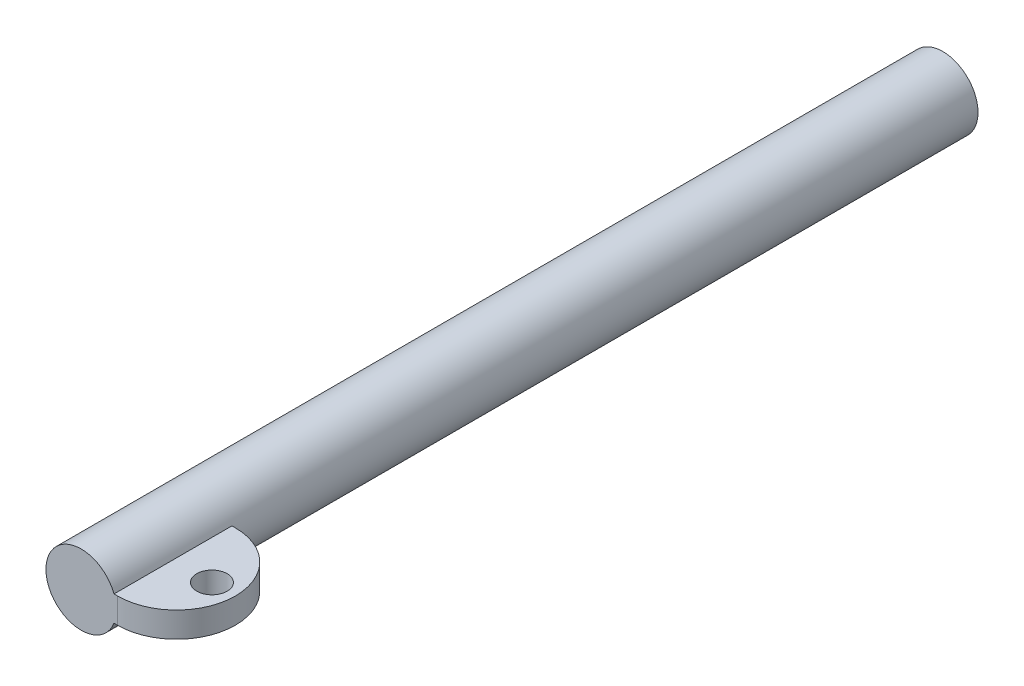
ISO-10303-21;
HEADER;
FILE_DESCRIPTION(('STEP AP214'),'2;1');
FILE_NAME('part.step','',(''),(''),'','','');
FILE_SCHEMA(('AUTOMOTIVE_DESIGN { 1 0 10303 214 1 1 1 1 }'));
ENDSEC;
DATA;
#1=APPLICATION_CONTEXT('core data for automotive mechanical design processes');
#2=APPLICATION_PROTOCOL_DEFINITION('international standard','automotive_design',2000,#1);
#3=PRODUCT_CONTEXT('',#1,'mechanical');
#4=PRODUCT('Part','Part','',(#3));
#5=PRODUCT_RELATED_PRODUCT_CATEGORY('part','',(#4));
#6=PRODUCT_DEFINITION_FORMATION('','',#4);
#7=PRODUCT_DEFINITION_CONTEXT('part definition',#1,'design');
#8=PRODUCT_DEFINITION('design','',#6,#7);
#9=PRODUCT_DEFINITION_SHAPE('','',#8);
#10=(LENGTH_UNIT() NAMED_UNIT(*) SI_UNIT(.MILLI.,.METRE.));
#11=(NAMED_UNIT(*) PLANE_ANGLE_UNIT() SI_UNIT($,.RADIAN.));
#12=(NAMED_UNIT(*) SI_UNIT($,.STERADIAN.) SOLID_ANGLE_UNIT());
#13=UNCERTAINTY_MEASURE_WITH_UNIT(LENGTH_MEASURE(1.E-05),#10,'distance_accuracy_value','');
#14=(GEOMETRIC_REPRESENTATION_CONTEXT(3) GLOBAL_UNCERTAINTY_ASSIGNED_CONTEXT((#13)) GLOBAL_UNIT_ASSIGNED_CONTEXT((#10,
#11,#12)) REPRESENTATION_CONTEXT('',''));
#15=CARTESIAN_POINT('',(0.,0.,0.));
#16=DIRECTION('',(0.,0.,1.));
#17=DIRECTION('',(1.,0.,0.));
#18=AXIS2_PLACEMENT_3D('',#15,#16,#17);
#19=CARTESIAN_POINT('',(-6.66133814775094E-13,0.,-431.8));
#20=DIRECTION('',(0.,0.,1.));
#21=DIRECTION('',(1.,0.,0.));
#22=AXIS2_PLACEMENT_3D('',#19,#20,#21);
#23=CYLINDRICAL_SURFACE('',#22,17.653);
#24=DIRECTION('',(0.,0.,1.));
#25=VECTOR('',#24,1.);
#26=CARTESIAN_POINT('',(16.471366336767,6.35000000000005,-431.8));
#27=LINE('',#26,#25);
#28=CARTESIAN_POINT('',(16.4713663367668,6.35000000000005,-59.0746447566882));
#29=VERTEX_POINT('',#28);
#30=CARTESIAN_POINT('',(16.4713663367675,6.35000000000005,0.));
#31=VERTEX_POINT('',#30);
#32=EDGE_CURVE('E54',#29,#31,#27,.T.);
#33=ORIENTED_EDGE('',*,*,#32,.F.);
#34=CARTESIAN_POINT('',(-6.66133814775094E-13,0.,-59.0746447566882));
#35=DIRECTION('',(0.,0.,1.));
#36=DIRECTION('',(1.,0.,0.));
#37=AXIS2_PLACEMENT_3D('',#34,#35,#36);
#38=CIRCLE('',#37,17.653);
#39=CARTESIAN_POINT('',(16.4713663367668,-6.34999999999998,-59.0746447566882));
#40=VERTEX_POINT('',#39);
#41=EDGE_CURVE('E11',#29,#40,#38,.F.);
#42=ORIENTED_EDGE('',*,*,#41,.T.);
#43=DIRECTION('',(0.,0.,1.));
#44=VECTOR('',#43,1.);
#45=CARTESIAN_POINT('',(16.471366336767,-6.34999999999998,-431.8));
#46=LINE('',#45,#44);
#47=CARTESIAN_POINT('',(16.4713663367675,-6.34999999999998,0.));
#48=VERTEX_POINT('',#47);
#49=EDGE_CURVE('E82',#40,#48,#46,.T.);
#50=ORIENTED_EDGE('',*,*,#49,.T.);
#51=CARTESIAN_POINT('',(0.,0.,0.));
#52=DIRECTION('',(0.,0.,1.));
#53=DIRECTION('',(1.,0.,0.));
#54=AXIS2_PLACEMENT_3D('',#51,#52,#53);
#55=CIRCLE('',#54,17.653);
#56=EDGE_CURVE('E109',#31,#48,#55,.T.);
#57=ORIENTED_EDGE('',*,*,#56,.F.);
#58=EDGE_LOOP('',(#33,#42,#50,#57));
#59=FACE_BOUND('',#58,.T.);
#60=CARTESIAN_POINT('',(-6.66133814775094E-13,0.,-431.8));
#61=DIRECTION('',(0.,0.,1.));
#62=DIRECTION('',(1.,0.,0.));
#63=AXIS2_PLACEMENT_3D('',#60,#61,#62);
#64=CIRCLE('',#63,17.653);
#65=CARTESIAN_POINT('',(17.6529999999993,0.,-431.8));
#66=VERTEX_POINT('',#65);
#67=EDGE_CURVE('E39',#66,#66,#64,.T.);
#68=ORIENTED_EDGE('',*,*,#67,.T.);
#69=EDGE_LOOP('',(#68));
#70=FACE_BOUND('',#69,.T.);
#71=ADVANCED_FACE('F32',(#59,#70),#23,.T.);
#72=CARTESIAN_POINT('',(-6.66133814775094E-13,0.,-431.8));
#73=DIRECTION('',(0.,0.,1.));
#74=DIRECTION('',(1.,0.,0.));
#75=AXIS2_PLACEMENT_3D('',#72,#73,#74);
#76=PLANE('',#75);
#77=ORIENTED_EDGE('',*,*,#67,.F.);
#78=EDGE_LOOP('',(#77));
#79=FACE_BOUND('',#78,.T.);
#80=ADVANCED_FACE('F133',(#79),#76,.F.);
#81=CARTESIAN_POINT('',(0.,0.,0.));
#82=DIRECTION('',(0.,0.,1.));
#83=DIRECTION('',(1.,0.,0.));
#84=AXIS2_PLACEMENT_3D('',#81,#82,#83);
#85=PLANE('',#84);
#86=ORIENTED_EDGE('',*,*,#56,.T.);
#87=DIRECTION('',(1.,0.,0.));
#88=VECTOR('',#87,1.);
#89=CARTESIAN_POINT('',(18.2311661506709,-6.34999999999998,0.));
#90=LINE('',#89,#88);
#91=CARTESIAN_POINT('',(18.2311661506709,-6.34999999999998,0.));
#92=VERTEX_POINT('',#91);
#93=EDGE_CURVE('E46',#48,#92,#90,.T.);
#94=ORIENTED_EDGE('',*,*,#93,.T.);
#95=DIRECTION('',(0.,-1.,0.));
#96=VECTOR('',#95,1.);
#97=CARTESIAN_POINT('',(18.2311661506709,6.35000000000005,0.));
#98=LINE('',#97,#96);
#99=CARTESIAN_POINT('',(18.2311661506709,6.35000000000005,0.));
#100=VERTEX_POINT('',#99);
#101=EDGE_CURVE('E83',#100,#92,#98,.T.);
#102=ORIENTED_EDGE('',*,*,#101,.F.);
#103=DIRECTION('',(1.,0.,0.));
#104=VECTOR('',#103,1.);
#105=CARTESIAN_POINT('',(18.2311661506709,6.35000000000005,0.));
#106=LINE('',#105,#104);
#107=EDGE_CURVE('E104',#31,#100,#106,.T.);
#108=ORIENTED_EDGE('',*,*,#107,.F.);
#109=EDGE_LOOP('',(#86,#94,#102,#108));
#110=FACE_BOUND('',#109,.T.);
#111=ADVANCED_FACE('F114',(#110),#85,.T.);
#112=CARTESIAN_POINT('',(18.2311661506709,6.35000000000006,-29.5373223783441));
#113=DIRECTION('',(0.,1.,0.));
#114=DIRECTION('',(0.,0.,1.));
#115=AXIS2_PLACEMENT_3D('',#112,#113,#114);
#116=PLANE('',#115);
#117=DIRECTION('',(-1.,0.,0.));
#118=VECTOR('',#117,1.);
#119=CARTESIAN_POINT('',(18.2311661506698,6.35000000000005,-59.0746447566882));
#120=LINE('',#119,#118);
#121=CARTESIAN_POINT('',(18.2311661506698,6.35000000000005,-59.0746447566882));
#122=VERTEX_POINT('',#121);
#123=EDGE_CURVE('E77',#122,#29,#120,.T.);
#124=ORIENTED_EDGE('',*,*,#123,.T.);
#125=ORIENTED_EDGE('',*,*,#32,.T.);
#126=ORIENTED_EDGE('',*,*,#107,.T.);
#127=CARTESIAN_POINT('',(18.2311661506709,6.35000000000006,-29.5373223783441));
#128=DIRECTION('',(0.,1.,0.));
#129=DIRECTION('',(0.,0.,1.));
#130=AXIS2_PLACEMENT_3D('',#127,#128,#129);
#131=CIRCLE('',#130,29.5373223783441);
#132=EDGE_CURVE('E101',#100,#122,#131,.T.);
#133=ORIENTED_EDGE('',*,*,#132,.T.);
#134=EDGE_LOOP('',(#124,#125,#126,#133));
#135=FACE_BOUND('',#134,.T.);
#136=CARTESIAN_POINT('',(36.0111661506708,6.35000000000005,-29.5373223783441));
#137=DIRECTION('',(0.,1.,0.));
#138=DIRECTION('',(0.,0.,1.));
#139=AXIS2_PLACEMENT_3D('',#136,#137,#138);
#140=CIRCLE('',#139,7.62);
#141=CARTESIAN_POINT('',(36.0111661506708,6.35000000000005,-21.9173223783441));
#142=VERTEX_POINT('',#141);
#143=EDGE_CURVE('E98',#142,#142,#140,.T.);
#144=ORIENTED_EDGE('',*,*,#143,.F.);
#145=EDGE_LOOP('',(#144));
#146=FACE_BOUND('',#145,.T.);
#147=ADVANCED_FACE('F117',(#135,#146),#116,.T.);
#148=CARTESIAN_POINT('',(18.2311661506709,6.35000000000006,-29.5373223783441));
#149=DIRECTION('',(0.,-1.,0.));
#150=DIRECTION('',(0.,0.,-1.));
#151=AXIS2_PLACEMENT_3D('',#148,#149,#150);
#152=CYLINDRICAL_SURFACE('',#151,29.5373223783441);
#153=ORIENTED_EDGE('',*,*,#101,.T.);
#154=CARTESIAN_POINT('',(18.2311661506702,-6.34999999999996,-29.5373223783441));
#155=DIRECTION('',(0.,1.,0.));
#156=DIRECTION('',(0.,0.,1.));
#157=AXIS2_PLACEMENT_3D('',#154,#155,#156);
#158=CIRCLE('',#157,29.5373223783441);
#159=CARTESIAN_POINT('',(18.2311661506698,-6.34999999999998,-59.0746447566882));
#160=VERTEX_POINT('',#159);
#161=EDGE_CURVE('E87',#92,#160,#158,.T.);
#162=ORIENTED_EDGE('',*,*,#161,.T.);
#163=DIRECTION('',(0.,-1.,0.));
#164=VECTOR('',#163,1.);
#165=CARTESIAN_POINT('',(18.2311661506698,6.35000000000005,-59.0746447566882));
#166=LINE('',#165,#164);
#167=EDGE_CURVE('E73',#122,#160,#166,.T.);
#168=ORIENTED_EDGE('',*,*,#167,.F.);
#169=ORIENTED_EDGE('',*,*,#132,.F.);
#170=EDGE_LOOP('',(#153,#162,#168,#169));
#171=FACE_BOUND('',#170,.T.);
#172=ADVANCED_FACE('F90',(#171),#152,.T.);
#173=CARTESIAN_POINT('',(18.2311661506698,6.35000000000005,-59.0746447566882));
#174=DIRECTION('',(0.,0.,1.));
#175=DIRECTION('',(1.,0.,0.));
#176=AXIS2_PLACEMENT_3D('',#173,#174,#175);
#177=PLANE('',#176);
#178=ORIENTED_EDGE('',*,*,#41,.F.);
#179=ORIENTED_EDGE('',*,*,#123,.F.);
#180=ORIENTED_EDGE('',*,*,#167,.T.);
#181=DIRECTION('',(-1.,0.,0.));
#182=VECTOR('',#181,1.);
#183=CARTESIAN_POINT('',(18.2311661506698,-6.34999999999998,-59.0746447566882));
#184=LINE('',#183,#182);
#185=EDGE_CURVE('E76',#160,#40,#184,.T.);
#186=ORIENTED_EDGE('',*,*,#185,.T.);
#187=EDGE_LOOP('',(#178,#179,#180,#186));
#188=FACE_BOUND('',#187,.T.);
#189=ADVANCED_FACE('F75',(#188),#177,.F.);
#190=CARTESIAN_POINT('',(36.0111661506708,6.35000000000005,-29.5373223783441));
#191=DIRECTION('',(0.,-1.,0.));
#192=DIRECTION('',(0.,0.,-1.));
#193=AXIS2_PLACEMENT_3D('',#190,#191,#192);
#194=CYLINDRICAL_SURFACE('',#193,7.62);
#195=ORIENTED_EDGE('',*,*,#143,.T.);
#196=EDGE_LOOP('',(#195));
#197=FACE_BOUND('',#196,.T.);
#198=CARTESIAN_POINT('',(36.0111661506701,-6.34999999999996,-29.5373223783441));
#199=DIRECTION('',(0.,1.,0.));
#200=DIRECTION('',(0.,0.,1.));
#201=AXIS2_PLACEMENT_3D('',#198,#199,#200);
#202=CIRCLE('',#201,7.62);
#203=CARTESIAN_POINT('',(36.0111661506701,-6.34999999999996,-21.9173223783441));
#204=VERTEX_POINT('',#203);
#205=EDGE_CURVE('E92',#204,#204,#202,.T.);
#206=ORIENTED_EDGE('',*,*,#205,.F.);
#207=EDGE_LOOP('',(#206));
#208=FACE_BOUND('',#207,.T.);
#209=ADVANCED_FACE('F123',(#197,#208),#194,.F.);
#210=CARTESIAN_POINT('',(18.2311661506702,-6.34999999999996,-29.5373223783441));
#211=DIRECTION('',(0.,1.,0.));
#212=DIRECTION('',(0.,0.,1.));
#213=AXIS2_PLACEMENT_3D('',#210,#211,#212);
#214=PLANE('',#213);
#215=ORIENTED_EDGE('',*,*,#49,.F.);
#216=ORIENTED_EDGE('',*,*,#185,.F.);
#217=ORIENTED_EDGE('',*,*,#161,.F.);
#218=ORIENTED_EDGE('',*,*,#93,.F.);
#219=EDGE_LOOP('',(#215,#216,#217,#218));
#220=FACE_BOUND('',#219,.T.);
#221=ORIENTED_EDGE('',*,*,#205,.T.);
#222=EDGE_LOOP('',(#221));
#223=FACE_BOUND('',#222,.T.);
#224=ADVANCED_FACE('F85',(#220,#223),#214,.F.);
#225=CLOSED_SHELL('',(#71,#80,#111,#147,#172,#189,#209,#224));
#226=MANIFOLD_SOLID_BREP('B2',#225);
#227=ADVANCED_BREP_SHAPE_REPRESENTATION('',(#18,#226),#14);
#228=SHAPE_DEFINITION_REPRESENTATION(#9,#227);
ENDSEC;
END-ISO-10303-21;
